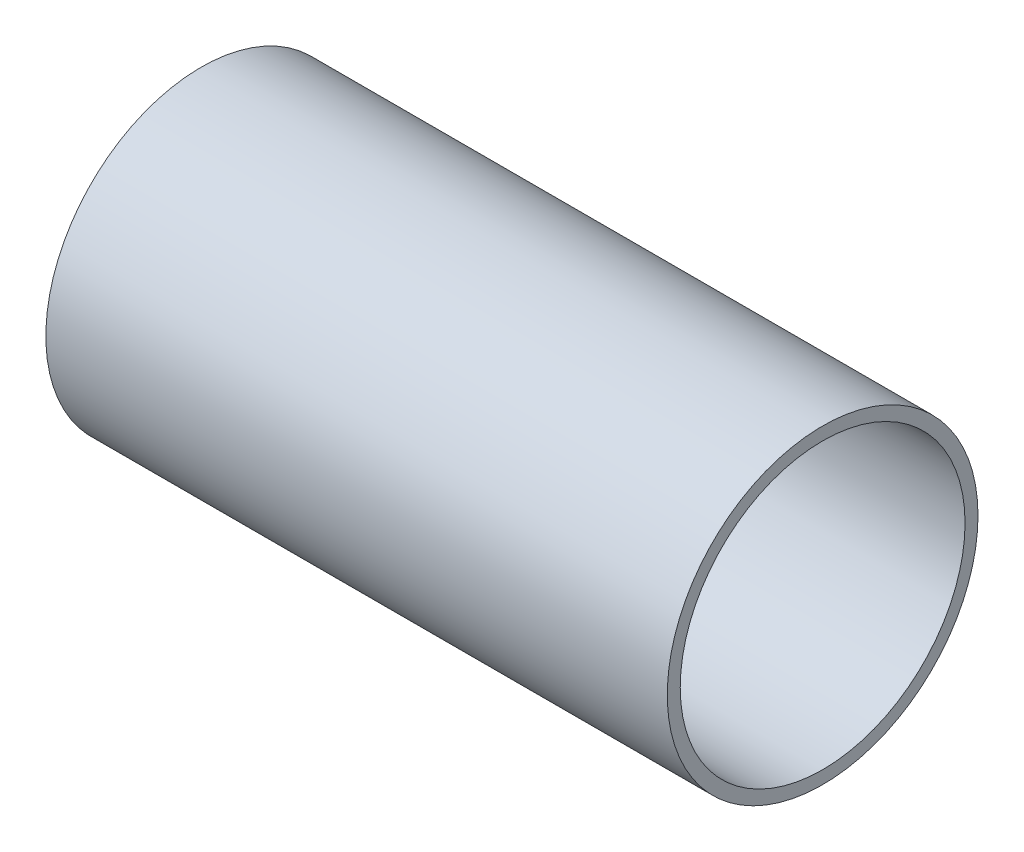
ISO-10303-21;
HEADER;
FILE_DESCRIPTION(('STEP AP214'),'2;1');
FILE_NAME('part.step','',(''),(''),'','','');
FILE_SCHEMA(('AUTOMOTIVE_DESIGN { 1 0 10303 214 1 1 1 1 }'));
ENDSEC;
DATA;
#1=APPLICATION_CONTEXT('core data for automotive mechanical design processes');
#2=APPLICATION_PROTOCOL_DEFINITION('international standard','automotive_design',2000,#1);
#3=PRODUCT_CONTEXT('',#1,'mechanical');
#4=PRODUCT('Part','Part','',(#3));
#5=PRODUCT_RELATED_PRODUCT_CATEGORY('part','',(#4));
#6=PRODUCT_DEFINITION_FORMATION('','',#4);
#7=PRODUCT_DEFINITION_CONTEXT('part definition',#1,'design');
#8=PRODUCT_DEFINITION('design','',#6,#7);
#9=PRODUCT_DEFINITION_SHAPE('','',#8);
#10=(LENGTH_UNIT() NAMED_UNIT(*) SI_UNIT(.MILLI.,.METRE.));
#11=(NAMED_UNIT(*) PLANE_ANGLE_UNIT() SI_UNIT($,.RADIAN.));
#12=(NAMED_UNIT(*) SI_UNIT($,.STERADIAN.) SOLID_ANGLE_UNIT());
#13=UNCERTAINTY_MEASURE_WITH_UNIT(LENGTH_MEASURE(1.E-05),#10,'distance_accuracy_value','');
#14=(GEOMETRIC_REPRESENTATION_CONTEXT(3) GLOBAL_UNCERTAINTY_ASSIGNED_CONTEXT((#13)) GLOBAL_UNIT_ASSIGNED_CONTEXT((#10,
#11,#12)) REPRESENTATION_CONTEXT('',''));
#15=CARTESIAN_POINT('',(0.,0.,0.));
#16=DIRECTION('',(0.,0.,1.));
#17=DIRECTION('',(1.,0.,0.));
#18=AXIS2_PLACEMENT_3D('',#15,#16,#17);
#19=CARTESIAN_POINT('',(-152.4,0.,0.));
#20=DIRECTION('',(1.,0.,0.));
#21=DIRECTION('',(0.,0.,-1.));
#22=AXIS2_PLACEMENT_3D('',#19,#20,#21);
#23=CYLINDRICAL_SURFACE('',#22,76.2);
#24=CARTESIAN_POINT('',(-152.4,0.,0.));
#25=DIRECTION('',(1.,0.,0.));
#26=DIRECTION('',(0.,0.,-1.));
#27=AXIS2_PLACEMENT_3D('',#24,#25,#26);
#28=CIRCLE('',#27,76.2);
#29=CARTESIAN_POINT('',(-152.4,0.,-76.2));
#30=VERTEX_POINT('',#29);
#31=EDGE_CURVE('E10',#30,#30,#28,.T.);
#32=CARTESIAN_POINT('',(152.4,0.,0.));
#33=DIRECTION('',(1.,0.,0.));
#34=DIRECTION('',(0.,0.,-1.));
#35=AXIS2_PLACEMENT_3D('',#32,#33,#34);
#36=CIRCLE('',#35,76.2);
#37=CARTESIAN_POINT('',(152.4,0.,-76.2));
#38=VERTEX_POINT('',#37);
#39=EDGE_CURVE('E41',#38,#38,#36,.T.);
#40=CARTESIAN_POINT('',(-152.4,0.,-76.2));
#41=CARTESIAN_POINT('',(-149.225,0.,-76.2));
#42=CARTESIAN_POINT('',(-146.05,0.,-76.2));
#43=CARTESIAN_POINT('',(-139.7,0.,-76.2));
#44=CARTESIAN_POINT('',(-136.525,0.,-76.2));
#45=CARTESIAN_POINT('',(-130.175,0.,-76.2));
#46=CARTESIAN_POINT('',(-127.,0.,-76.2));
#47=CARTESIAN_POINT('',(-120.65,0.,-76.2));
#48=CARTESIAN_POINT('',(-117.475,0.,-76.2));
#49=CARTESIAN_POINT('',(-111.125,0.,-76.2));
#50=CARTESIAN_POINT('',(-107.95,0.,-76.2));
#51=CARTESIAN_POINT('',(-101.6,0.,-76.2));
#52=CARTESIAN_POINT('',(-98.425,0.,-76.2));
#53=CARTESIAN_POINT('',(-92.075,0.,-76.2));
#54=CARTESIAN_POINT('',(-88.9,0.,-76.2));
#55=CARTESIAN_POINT('',(-82.55,0.,-76.2));
#56=CARTESIAN_POINT('',(-79.375,0.,-76.2));
#57=CARTESIAN_POINT('',(-73.025,0.,-76.2));
#58=CARTESIAN_POINT('',(-69.85,0.,-76.2));
#59=CARTESIAN_POINT('',(-63.5,0.,-76.2));
#60=CARTESIAN_POINT('',(-60.325,0.,-76.2));
#61=CARTESIAN_POINT('',(-53.975,0.,-76.2));
#62=CARTESIAN_POINT('',(-50.8,0.,-76.2));
#63=CARTESIAN_POINT('',(-44.45,0.,-76.2));
#64=CARTESIAN_POINT('',(-41.275,0.,-76.2));
#65=CARTESIAN_POINT('',(-34.925,0.,-76.2));
#66=CARTESIAN_POINT('',(-31.75,0.,-76.2));
#67=CARTESIAN_POINT('',(-25.4,0.,-76.2));
#68=CARTESIAN_POINT('',(-22.225,0.,-76.2));
#69=CARTESIAN_POINT('',(-15.875,0.,-76.2));
#70=CARTESIAN_POINT('',(-12.7,0.,-76.2));
#71=CARTESIAN_POINT('',(-6.35,0.,-76.2));
#72=CARTESIAN_POINT('',(-3.175,0.,-76.2));
#73=CARTESIAN_POINT('',(3.175,0.,-76.2));
#74=CARTESIAN_POINT('',(6.35,0.,-76.2));
#75=CARTESIAN_POINT('',(12.7,0.,-76.2));
#76=CARTESIAN_POINT('',(15.875,0.,-76.2));
#77=CARTESIAN_POINT('',(22.225,0.,-76.2));
#78=CARTESIAN_POINT('',(25.4,0.,-76.2));
#79=CARTESIAN_POINT('',(31.75,0.,-76.2));
#80=CARTESIAN_POINT('',(34.925,0.,-76.2));
#81=CARTESIAN_POINT('',(41.275,0.,-76.2));
#82=CARTESIAN_POINT('',(44.45,0.,-76.2));
#83=CARTESIAN_POINT('',(50.8,0.,-76.2));
#84=CARTESIAN_POINT('',(53.975,0.,-76.2));
#85=CARTESIAN_POINT('',(60.325,0.,-76.2));
#86=CARTESIAN_POINT('',(63.5,0.,-76.2));
#87=CARTESIAN_POINT('',(69.85,0.,-76.2));
#88=CARTESIAN_POINT('',(73.025,0.,-76.2));
#89=CARTESIAN_POINT('',(79.375,0.,-76.2));
#90=CARTESIAN_POINT('',(82.55,0.,-76.2));
#91=CARTESIAN_POINT('',(88.9,0.,-76.2));
#92=CARTESIAN_POINT('',(92.075,0.,-76.2));
#93=CARTESIAN_POINT('',(98.425,0.,-76.2));
#94=CARTESIAN_POINT('',(101.6,0.,-76.2));
#95=CARTESIAN_POINT('',(107.95,0.,-76.2));
#96=CARTESIAN_POINT('',(111.125,0.,-76.2));
#97=CARTESIAN_POINT('',(117.475,0.,-76.2));
#98=CARTESIAN_POINT('',(120.65,0.,-76.2));
#99=CARTESIAN_POINT('',(127.,0.,-76.2));
#100=CARTESIAN_POINT('',(130.175,0.,-76.2));
#101=CARTESIAN_POINT('',(136.525,0.,-76.2));
#102=CARTESIAN_POINT('',(139.7,0.,-76.2));
#103=CARTESIAN_POINT('',(146.05,0.,-76.2));
#104=CARTESIAN_POINT('',(149.225,0.,-76.2));
#105=CARTESIAN_POINT('',(152.4,0.,-76.2));
#106=B_SPLINE_CURVE_WITH_KNOTS('',3,(#40,#41,#42,#43,#44,#45,#46,#47,#48,#49,#50,#51,#52,#53,
#54,#55,#56,#57,#58,#59,#60,#61,#62,#63,#64,#65,#66,#67,#68,#69,#70,#71,#72,#73,#74,#75,#76,#77,
#78,#79,#80,#81,#82,#83,#84,#85,#86,#87,#88,#89,#90,#91,#92,#93,#94,#95,#96,#97,#98,#99,#100,
#101,#102,#103,#104,#105),.UNSPECIFIED.,.F.,.F.,(4,2,2,2,2,2,2,2,2,2,2,2,2,2,2,2,2,2,2,2,2,2,2,
2,2,2,2,2,2,2,2,2,4),(0.,9.52499999999998,19.05,28.575,38.1,47.625,57.15,66.675,76.2,85.725,
95.25,104.775,114.3,123.825,133.35,142.875,152.4,161.925,171.45,180.975,190.5,200.025,209.55,
219.075,228.6,238.125,247.65,257.175,266.7,276.225,285.75,295.275,304.8),.UNSPECIFIED.);
#107=EDGE_CURVE('BSEAM31',#30,#38,#106,.T.);
#108=ORIENTED_EDGE('',*,*,#31,.T.);
#109=ORIENTED_EDGE('',*,*,#39,.F.);
#110=ORIENTED_EDGE('',*,*,#107,.T.);
#111=ORIENTED_EDGE('',*,*,#107,.F.);
#112=EDGE_LOOP('',(#108,#110,#109,#111));
#113=FACE_BOUND('',#112,.T.);
#114=ADVANCED_FACE('F31',(#113),#23,.T.);
#115=CARTESIAN_POINT('',(-152.4,0.,0.));
#116=DIRECTION('',(1.,0.,0.));
#117=DIRECTION('',(0.,0.,-1.));
#118=AXIS2_PLACEMENT_3D('',#115,#116,#117);
#119=PLANE('',#118);
#120=CARTESIAN_POINT('',(-152.4,0.,0.));
#121=DIRECTION('',(1.,0.,0.));
#122=DIRECTION('',(0.,0.,-1.));
#123=AXIS2_PLACEMENT_3D('',#120,#121,#122);
#124=CIRCLE('',#123,69.85);
#125=CARTESIAN_POINT('',(-152.4,0.,-69.85));
#126=VERTEX_POINT('',#125);
#127=EDGE_CURVE('E37',#126,#126,#124,.T.);
#128=ORIENTED_EDGE('',*,*,#127,.T.);
#129=EDGE_LOOP('',(#128));
#130=FACE_BOUND('',#129,.T.);
#131=ORIENTED_EDGE('',*,*,#31,.F.);
#132=EDGE_LOOP('',(#131));
#133=FACE_BOUND('',#132,.T.);
#134=ADVANCED_FACE('F60',(#130,#133),#119,.F.);
#135=CARTESIAN_POINT('',(-152.4,0.,0.));
#136=DIRECTION('',(1.,0.,0.));
#137=DIRECTION('',(0.,0.,-1.));
#138=AXIS2_PLACEMENT_3D('',#135,#136,#137);
#139=CYLINDRICAL_SURFACE('',#138,69.85);
#140=CARTESIAN_POINT('',(152.4,0.,0.));
#141=DIRECTION('',(1.,0.,0.));
#142=DIRECTION('',(0.,0.,-1.));
#143=AXIS2_PLACEMENT_3D('',#140,#141,#142);
#144=CIRCLE('',#143,69.85);
#145=CARTESIAN_POINT('',(152.4,0.,-69.85));
#146=VERTEX_POINT('',#145);
#147=EDGE_CURVE('E45',#146,#146,#144,.T.);
#148=CARTESIAN_POINT('',(-152.4,0.,-69.85));
#149=CARTESIAN_POINT('',(-149.225,0.,-69.85));
#150=CARTESIAN_POINT('',(-146.05,0.,-69.85));
#151=CARTESIAN_POINT('',(-139.7,0.,-69.85));
#152=CARTESIAN_POINT('',(-136.525,0.,-69.85));
#153=CARTESIAN_POINT('',(-130.175,0.,-69.85));
#154=CARTESIAN_POINT('',(-127.,0.,-69.85));
#155=CARTESIAN_POINT('',(-120.65,0.,-69.85));
#156=CARTESIAN_POINT('',(-117.475,0.,-69.85));
#157=CARTESIAN_POINT('',(-111.125,0.,-69.85));
#158=CARTESIAN_POINT('',(-107.95,0.,-69.85));
#159=CARTESIAN_POINT('',(-101.6,0.,-69.85));
#160=CARTESIAN_POINT('',(-98.425,0.,-69.85));
#161=CARTESIAN_POINT('',(-92.075,0.,-69.85));
#162=CARTESIAN_POINT('',(-88.9,0.,-69.85));
#163=CARTESIAN_POINT('',(-82.55,0.,-69.85));
#164=CARTESIAN_POINT('',(-79.375,0.,-69.85));
#165=CARTESIAN_POINT('',(-73.025,0.,-69.85));
#166=CARTESIAN_POINT('',(-69.85,0.,-69.85));
#167=CARTESIAN_POINT('',(-63.5,0.,-69.85));
#168=CARTESIAN_POINT('',(-60.325,0.,-69.85));
#169=CARTESIAN_POINT('',(-53.975,0.,-69.85));
#170=CARTESIAN_POINT('',(-50.8,0.,-69.85));
#171=CARTESIAN_POINT('',(-44.45,0.,-69.85));
#172=CARTESIAN_POINT('',(-41.275,0.,-69.85));
#173=CARTESIAN_POINT('',(-34.925,0.,-69.85));
#174=CARTESIAN_POINT('',(-31.75,0.,-69.85));
#175=CARTESIAN_POINT('',(-25.4,0.,-69.85));
#176=CARTESIAN_POINT('',(-22.225,0.,-69.85));
#177=CARTESIAN_POINT('',(-15.875,0.,-69.85));
#178=CARTESIAN_POINT('',(-12.7,0.,-69.85));
#179=CARTESIAN_POINT('',(-6.35000000000003,0.,-69.85));
#180=CARTESIAN_POINT('',(-3.17500000000003,0.,-69.85));
#181=CARTESIAN_POINT('',(3.17499999999997,0.,-69.85));
#182=CARTESIAN_POINT('',(6.34999999999998,0.,-69.85));
#183=CARTESIAN_POINT('',(12.7,0.,-69.85));
#184=CARTESIAN_POINT('',(15.875,0.,-69.85));
#185=CARTESIAN_POINT('',(22.225,0.,-69.85));
#186=CARTESIAN_POINT('',(25.4,0.,-69.85));
#187=CARTESIAN_POINT('',(31.75,0.,-69.85));
#188=CARTESIAN_POINT('',(34.925,0.,-69.85));
#189=CARTESIAN_POINT('',(41.275,0.,-69.85));
#190=CARTESIAN_POINT('',(44.45,0.,-69.85));
#191=CARTESIAN_POINT('',(50.8,0.,-69.85));
#192=CARTESIAN_POINT('',(53.975,0.,-69.85));
#193=CARTESIAN_POINT('',(60.325,0.,-69.85));
#194=CARTESIAN_POINT('',(63.5,0.,-69.85));
#195=CARTESIAN_POINT('',(69.85,0.,-69.85));
#196=CARTESIAN_POINT('',(73.025,0.,-69.85));
#197=CARTESIAN_POINT('',(79.375,0.,-69.85));
#198=CARTESIAN_POINT('',(82.55,0.,-69.85));
#199=CARTESIAN_POINT('',(88.9,0.,-69.85));
#200=CARTESIAN_POINT('',(92.075,0.,-69.85));
#201=CARTESIAN_POINT('',(98.425,0.,-69.85));
#202=CARTESIAN_POINT('',(101.6,0.,-69.85));
#203=CARTESIAN_POINT('',(107.95,0.,-69.85));
#204=CARTESIAN_POINT('',(111.125,0.,-69.85));
#205=CARTESIAN_POINT('',(117.475,0.,-69.85));
#206=CARTESIAN_POINT('',(120.65,0.,-69.85));
#207=CARTESIAN_POINT('',(127.,0.,-69.85));
#208=CARTESIAN_POINT('',(130.175,0.,-69.85));
#209=CARTESIAN_POINT('',(136.525,0.,-69.85));
#210=CARTESIAN_POINT('',(139.7,0.,-69.85));
#211=CARTESIAN_POINT('',(146.05,0.,-69.85));
#212=CARTESIAN_POINT('',(149.225,0.,-69.85));
#213=CARTESIAN_POINT('',(152.4,0.,-69.85));
#214=B_SPLINE_CURVE_WITH_KNOTS('',3,(#148,#149,#150,#151,#152,#153,#154,#155,#156,#157,#158,
#159,#160,#161,#162,#163,#164,#165,#166,#167,#168,#169,#170,#171,#172,#173,#174,#175,#176,#177,
#178,#179,#180,#181,#182,#183,#184,#185,#186,#187,#188,#189,#190,#191,#192,#193,#194,#195,#196,
#197,#198,#199,#200,#201,#202,#203,#204,#205,#206,#207,#208,#209,#210,#211,#212,#213),
.UNSPECIFIED.,.F.,.F.,(4,2,2,2,2,2,2,2,2,2,2,2,2,2,2,2,2,2,2,2,2,2,2,2,2,2,2,2,2,2,2,2,4),(0.,
9.52500000000001,19.05,28.575,38.1,47.625,57.15,66.675,76.2,85.725,95.25,104.775,114.3,123.825,
133.35,142.875,152.4,161.925,171.45,180.975,190.5,200.025,209.55,219.075,228.6,238.125,247.65,
257.175,266.7,276.225,285.75,295.275,304.8),.UNSPECIFIED.);
#215=EDGE_CURVE('BSEAM51',#126,#146,#214,.T.);
#216=ORIENTED_EDGE('',*,*,#127,.F.);
#217=ORIENTED_EDGE('',*,*,#147,.T.);
#218=ORIENTED_EDGE('',*,*,#215,.T.);
#219=ORIENTED_EDGE('',*,*,#215,.F.);
#220=EDGE_LOOP('',(#216,#218,#217,#219));
#221=FACE_BOUND('',#220,.T.);
#222=ADVANCED_FACE('F51',(#221),#139,.F.);
#223=CARTESIAN_POINT('',(152.4,0.,0.));
#224=DIRECTION('',(1.,0.,0.));
#225=DIRECTION('',(0.,0.,-1.));
#226=AXIS2_PLACEMENT_3D('',#223,#224,#225);
#227=PLANE('',#226);
#228=ORIENTED_EDGE('',*,*,#39,.T.);
#229=EDGE_LOOP('',(#228));
#230=FACE_BOUND('',#229,.T.);
#231=ORIENTED_EDGE('',*,*,#147,.F.);
#232=EDGE_LOOP('',(#231));
#233=FACE_BOUND('',#232,.T.);
#234=ADVANCED_FACE('F53',(#230,#233),#227,.T.);
#235=CLOSED_SHELL('',(#114,#134,#222,#234));
#236=MANIFOLD_SOLID_BREP('B2',#235);
#237=ADVANCED_BREP_SHAPE_REPRESENTATION('',(#18,#236),#14);
#238=SHAPE_DEFINITION_REPRESENTATION(#9,#237);
ENDSEC;
END-ISO-10303-21;
